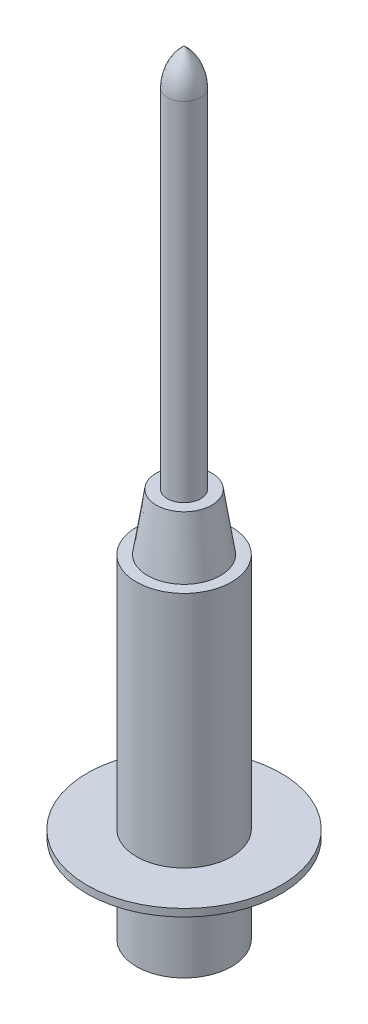
ISO-10303-21;
HEADER;
FILE_DESCRIPTION(('STEP AP214'),'2;1');
FILE_NAME('part.step','',(''),(''),'','','');
FILE_SCHEMA(('AUTOMOTIVE_DESIGN { 1 0 10303 214 1 1 1 1 }'));
ENDSEC;
DATA;
#1=APPLICATION_CONTEXT('core data for automotive mechanical design processes');
#2=APPLICATION_PROTOCOL_DEFINITION('international standard','automotive_design',2000,#1);
#3=PRODUCT_CONTEXT('',#1,'mechanical');
#4=PRODUCT('Part','Part','',(#3));
#5=PRODUCT_RELATED_PRODUCT_CATEGORY('part','',(#4));
#6=PRODUCT_DEFINITION_FORMATION('','',#4);
#7=PRODUCT_DEFINITION_CONTEXT('part definition',#1,'design');
#8=PRODUCT_DEFINITION('design','',#6,#7);
#9=PRODUCT_DEFINITION_SHAPE('','',#8);
#10=(LENGTH_UNIT() NAMED_UNIT(*) SI_UNIT(.MILLI.,.METRE.));
#11=(NAMED_UNIT(*) PLANE_ANGLE_UNIT() SI_UNIT($,.RADIAN.));
#12=(NAMED_UNIT(*) SI_UNIT($,.STERADIAN.) SOLID_ANGLE_UNIT());
#13=UNCERTAINTY_MEASURE_WITH_UNIT(LENGTH_MEASURE(1.E-05),#10,'distance_accuracy_value','');
#14=(GEOMETRIC_REPRESENTATION_CONTEXT(3) GLOBAL_UNCERTAINTY_ASSIGNED_CONTEXT((#13)) GLOBAL_UNIT_ASSIGNED_CONTEXT((#10,
#11,#12)) REPRESENTATION_CONTEXT('',''));
#15=CARTESIAN_POINT('',(0.,0.,0.));
#16=DIRECTION('',(0.,0.,1.));
#17=DIRECTION('',(1.,0.,0.));
#18=AXIS2_PLACEMENT_3D('',#15,#16,#17);
#19=CARTESIAN_POINT('',(0.,0.,0.));
#20=DIRECTION('',(0.,1.,0.));
#21=DIRECTION('',(0.,0.,1.));
#22=AXIS2_PLACEMENT_3D('',#19,#20,#21);
#23=PLANE('',#22);
#24=CARTESIAN_POINT('',(0.,0.,0.));
#25=DIRECTION('',(0.,1.,0.));
#26=DIRECTION('',(0.,0.,1.));
#27=AXIS2_PLACEMENT_3D('',#24,#25,#26);
#28=CIRCLE('',#27,4.28058569212625);
#29=CARTESIAN_POINT('',(0.,0.,4.28058569212625));
#30=VERTEX_POINT('',#29);
#31=EDGE_CURVE('E11',#30,#30,#28,.T.);
#32=ORIENTED_EDGE('',*,*,#31,.F.);
#33=EDGE_LOOP('',(#32));
#34=FACE_BOUND('',#33,.T.);
#35=ADVANCED_FACE('F41',(#34),#23,.F.);
#36=CARTESIAN_POINT('',(0.,69.5986072281651,0.));
#37=DIRECTION('',(0.,1.,0.));
#38=DIRECTION('',(0.,0.,1.));
#39=AXIS2_PLACEMENT_3D('',#36,#37,#38);
#40=CYLINDRICAL_SURFACE('',#39,4.28058569212624);
#41=CARTESIAN_POINT('',(0.,7.9,0.));
#42=DIRECTION('',(0.,1.,0.));
#43=DIRECTION('',(0.,0.,1.));
#44=AXIS2_PLACEMENT_3D('',#41,#42,#43);
#45=CIRCLE('',#44,4.28058569212624);
#46=CARTESIAN_POINT('',(0.,7.9,4.28058569212624));
#47=VERTEX_POINT('',#46);
#48=EDGE_CURVE('E47',#47,#47,#45,.T.);
#49=ORIENTED_EDGE('',*,*,#48,.F.);
#50=EDGE_LOOP('',(#49));
#51=FACE_BOUND('',#50,.T.);
#52=ORIENTED_EDGE('',*,*,#31,.T.);
#53=EDGE_LOOP('',(#52));
#54=FACE_BOUND('',#53,.T.);
#55=ADVANCED_FACE('F86',(#51,#54),#40,.T.);
#56=CARTESIAN_POINT('',(4.28058569212624,7.9,0.));
#57=DIRECTION('',(0.,1.,0.));
#58=DIRECTION('',(0.,0.,1.));
#59=AXIS2_PLACEMENT_3D('',#56,#57,#58);
#60=PLANE('',#59);
#61=CARTESIAN_POINT('',(0.,7.9,0.));
#62=DIRECTION('',(0.,1.,0.));
#63=DIRECTION('',(0.,0.,1.));
#64=AXIS2_PLACEMENT_3D('',#61,#62,#63);
#65=CIRCLE('',#64,8.73286490677104);
#66=CARTESIAN_POINT('',(0.,7.9,8.73286490677104));
#67=VERTEX_POINT('',#66);
#68=EDGE_CURVE('E79',#67,#67,#65,.T.);
#69=ORIENTED_EDGE('',*,*,#68,.F.);
#70=EDGE_LOOP('',(#69));
#71=FACE_BOUND('',#70,.T.);
#72=ORIENTED_EDGE('',*,*,#48,.T.);
#73=EDGE_LOOP('',(#72));
#74=FACE_BOUND('',#73,.T.);
#75=ADVANCED_FACE('F84',(#71,#74),#60,.F.);
#76=CARTESIAN_POINT('',(0.,69.5986072281651,0.));
#77=DIRECTION('',(0.,1.,0.));
#78=DIRECTION('',(0.,0.,1.));
#79=AXIS2_PLACEMENT_3D('',#76,#77,#78);
#80=CYLINDRICAL_SURFACE('',#79,8.73286490677104);
#81=CARTESIAN_POINT('',(0.,8.57,0.));
#82=DIRECTION('',(0.,1.,0.));
#83=DIRECTION('',(0.,0.,1.));
#84=AXIS2_PLACEMENT_3D('',#81,#82,#83);
#85=CIRCLE('',#84,8.73286490677104);
#86=CARTESIAN_POINT('',(0.,8.57,8.73286490677104));
#87=VERTEX_POINT('',#86);
#88=EDGE_CURVE('E76',#87,#87,#85,.T.);
#89=ORIENTED_EDGE('',*,*,#88,.F.);
#90=EDGE_LOOP('',(#89));
#91=FACE_BOUND('',#90,.T.);
#92=ORIENTED_EDGE('',*,*,#68,.T.);
#93=EDGE_LOOP('',(#92));
#94=FACE_BOUND('',#93,.T.);
#95=ADVANCED_FACE('F102',(#91,#94),#80,.T.);
#96=CARTESIAN_POINT('',(8.73286490677104,8.57,0.));
#97=DIRECTION('',(0.,-1.,0.));
#98=DIRECTION('',(0.,0.,-1.));
#99=AXIS2_PLACEMENT_3D('',#96,#97,#98);
#100=PLANE('',#99);
#101=CARTESIAN_POINT('',(0.,8.56999999999999,0.));
#102=DIRECTION('',(0.,1.,0.));
#103=DIRECTION('',(0.,0.,1.));
#104=AXIS2_PLACEMENT_3D('',#101,#102,#103);
#105=CIRCLE('',#104,4.28058569212625);
#106=CARTESIAN_POINT('',(0.,8.56999999999999,4.28058569212625));
#107=VERTEX_POINT('',#106);
#108=EDGE_CURVE('E73',#107,#107,#105,.T.);
#109=ORIENTED_EDGE('',*,*,#108,.F.);
#110=EDGE_LOOP('',(#109));
#111=FACE_BOUND('',#110,.T.);
#112=ORIENTED_EDGE('',*,*,#88,.T.);
#113=EDGE_LOOP('',(#112));
#114=FACE_BOUND('',#113,.T.);
#115=ADVANCED_FACE('F109',(#111,#114),#100,.F.);
#116=CARTESIAN_POINT('',(0.,69.5986072281651,0.));
#117=DIRECTION('',(0.,1.,0.));
#118=DIRECTION('',(0.,0.,1.));
#119=AXIS2_PLACEMENT_3D('',#116,#117,#118);
#120=CYLINDRICAL_SURFACE('',#119,4.28058569212624);
#121=CARTESIAN_POINT('',(0.,29.97,0.));
#122=DIRECTION('',(0.,1.,0.));
#123=DIRECTION('',(0.,0.,1.));
#124=AXIS2_PLACEMENT_3D('',#121,#122,#123);
#125=CIRCLE('',#124,4.28058569212624);
#126=CARTESIAN_POINT('',(0.,29.97,4.28058569212624));
#127=VERTEX_POINT('',#126);
#128=EDGE_CURVE('E70',#127,#127,#125,.T.);
#129=ORIENTED_EDGE('',*,*,#128,.F.);
#130=EDGE_LOOP('',(#129));
#131=FACE_BOUND('',#130,.T.);
#132=ORIENTED_EDGE('',*,*,#108,.T.);
#133=EDGE_LOOP('',(#132));
#134=FACE_BOUND('',#133,.T.);
#135=ADVANCED_FACE('F116',(#131,#134),#120,.T.);
#136=CARTESIAN_POINT('',(4.28058569212624,29.97,0.));
#137=DIRECTION('',(0.,-1.,0.));
#138=DIRECTION('',(0.,0.,-1.));
#139=AXIS2_PLACEMENT_3D('',#136,#137,#138);
#140=PLANE('',#139);
#141=CARTESIAN_POINT('',(0.,29.97,0.));
#142=DIRECTION('',(0.,1.,0.));
#143=DIRECTION('',(0.,0.,1.));
#144=AXIS2_PLACEMENT_3D('',#141,#142,#143);
#145=CIRCLE('',#144,3.28058569212624);
#146=CARTESIAN_POINT('',(0.,29.97,3.28058569212624));
#147=VERTEX_POINT('',#146);
#148=EDGE_CURVE('E67',#147,#147,#145,.T.);
#149=ORIENTED_EDGE('',*,*,#148,.F.);
#150=EDGE_LOOP('',(#149));
#151=FACE_BOUND('',#150,.T.);
#152=ORIENTED_EDGE('',*,*,#128,.T.);
#153=EDGE_LOOP('',(#152));
#154=FACE_BOUND('',#153,.T.);
#155=ADVANCED_FACE('F123',(#151,#154),#140,.F.);
#156=CARTESIAN_POINT('',(0.,29.97,0.));
#157=DIRECTION('',(0.,-1.,0.));
#158=DIRECTION('',(0.,0.,-1.));
#159=AXIS2_PLACEMENT_3D('',#156,#157,#158);
#160=CONICAL_SURFACE('',#159,3.28058569212624,0.151877370132769);
#161=CARTESIAN_POINT('',(0.,35.07,0.));
#162=DIRECTION('',(0.,1.,0.));
#163=DIRECTION('',(0.,0.,1.));
#164=AXIS2_PLACEMENT_3D('',#161,#162,#163);
#165=CIRCLE('',#164,2.49999999999998);
#166=CARTESIAN_POINT('',(0.,35.07,2.49999999999998));
#167=VERTEX_POINT('',#166);
#168=EDGE_CURVE('E62',#167,#167,#165,.T.);
#169=ORIENTED_EDGE('',*,*,#168,.F.);
#170=EDGE_LOOP('',(#169));
#171=FACE_BOUND('',#170,.T.);
#172=ORIENTED_EDGE('',*,*,#148,.T.);
#173=EDGE_LOOP('',(#172));
#174=FACE_BOUND('',#173,.T.);
#175=ADVANCED_FACE('F130',(#171,#174),#160,.T.);
#176=CARTESIAN_POINT('',(2.49999999999998,35.07,0.));
#177=DIRECTION('',(0.,-1.,0.));
#178=DIRECTION('',(0.,0.,-1.));
#179=AXIS2_PLACEMENT_3D('',#176,#177,#178);
#180=PLANE('',#179);
#181=CARTESIAN_POINT('',(0.,35.07,0.));
#182=DIRECTION('',(0.,1.,0.));
#183=DIRECTION('',(0.,0.,1.));
#184=AXIS2_PLACEMENT_3D('',#181,#182,#183);
#185=CIRCLE('',#184,1.49999999999998);
#186=CARTESIAN_POINT('',(0.,35.07,1.49999999999998));
#187=VERTEX_POINT('',#186);
#188=EDGE_CURVE('E59',#187,#187,#185,.T.);
#189=ORIENTED_EDGE('',*,*,#188,.F.);
#190=EDGE_LOOP('',(#189));
#191=FACE_BOUND('',#190,.T.);
#192=ORIENTED_EDGE('',*,*,#168,.T.);
#193=EDGE_LOOP('',(#192));
#194=FACE_BOUND('',#193,.T.);
#195=ADVANCED_FACE('F137',(#191,#194),#180,.F.);
#196=CARTESIAN_POINT('',(0.,69.5986072281651,0.));
#197=DIRECTION('',(0.,1.,0.));
#198=DIRECTION('',(0.,0.,1.));
#199=AXIS2_PLACEMENT_3D('',#196,#197,#198);
#200=CYLINDRICAL_SURFACE('',#199,1.49999999999999);
#201=CARTESIAN_POINT('',(0.,66.3238342811393,0.));
#202=DIRECTION('',(0.,1.,0.));
#203=DIRECTION('',(0.,0.,1.));
#204=AXIS2_PLACEMENT_3D('',#201,#202,#203);
#205=CIRCLE('',#204,1.49999999999999);
#206=CARTESIAN_POINT('',(0.,66.3238342811393,1.49999999999999));
#207=VERTEX_POINT('',#206);
#208=EDGE_CURVE('E57',#207,#207,#205,.T.);
#209=ORIENTED_EDGE('',*,*,#208,.F.);
#210=EDGE_LOOP('',(#209));
#211=FACE_BOUND('',#210,.T.);
#212=ORIENTED_EDGE('',*,*,#188,.T.);
#213=EDGE_LOOP('',(#212));
#214=FACE_BOUND('',#213,.T.);
#215=ADVANCED_FACE('F53',(#211,#214),#200,.T.);
#216=CARTESIAN_POINT('',(0.,66.3238342811393,-2.8247126181908));
#217=DIRECTION('',(-1.,0.,0.));
#218=DIRECTION('',(0.,0.,1.));
#219=AXIS2_PLACEMENT_3D('',#216,#217,#218);
#220=CIRCLE('',#219,4.3247126181908);
#221=TRIMMED_CURVE('',#220,(PARAMETER_VALUE(-0.859051294127413)),
(PARAMETER_VALUE(0.859051294127413)),.T.,.PARAMETER.);
#222=CARTESIAN_POINT('',(0.,66.3238342811393,0.));
#223=DIRECTION('',(0.,1.,0.));
#224=AXIS1_PLACEMENT('',#222,#223);
#225=SURFACE_OF_REVOLUTION('',#221,#224);
#226=CARTESIAN_POINT('',(0.,69.5986072281651,0.));
#227=VERTEX_POINT('',#226);
#228=VERTEX_LOOP('',#227);
#229=FACE_BOUND('',#228,.T.);
#230=ORIENTED_EDGE('',*,*,#208,.T.);
#231=EDGE_LOOP('',(#230));
#232=FACE_BOUND('',#231,.T.);
#233=ADVANCED_FACE('F50',(#229,#232),#225,.T.);
#234=CLOSED_SHELL('',(#35,#55,#75,#95,#115,#135,#155,#175,#195,#215,#233));
#235=MANIFOLD_SOLID_BREP('B2',#234);
#236=ADVANCED_BREP_SHAPE_REPRESENTATION('',(#18,#235),#14);
#237=SHAPE_DEFINITION_REPRESENTATION(#9,#236);
ENDSEC;
END-ISO-10303-21;
